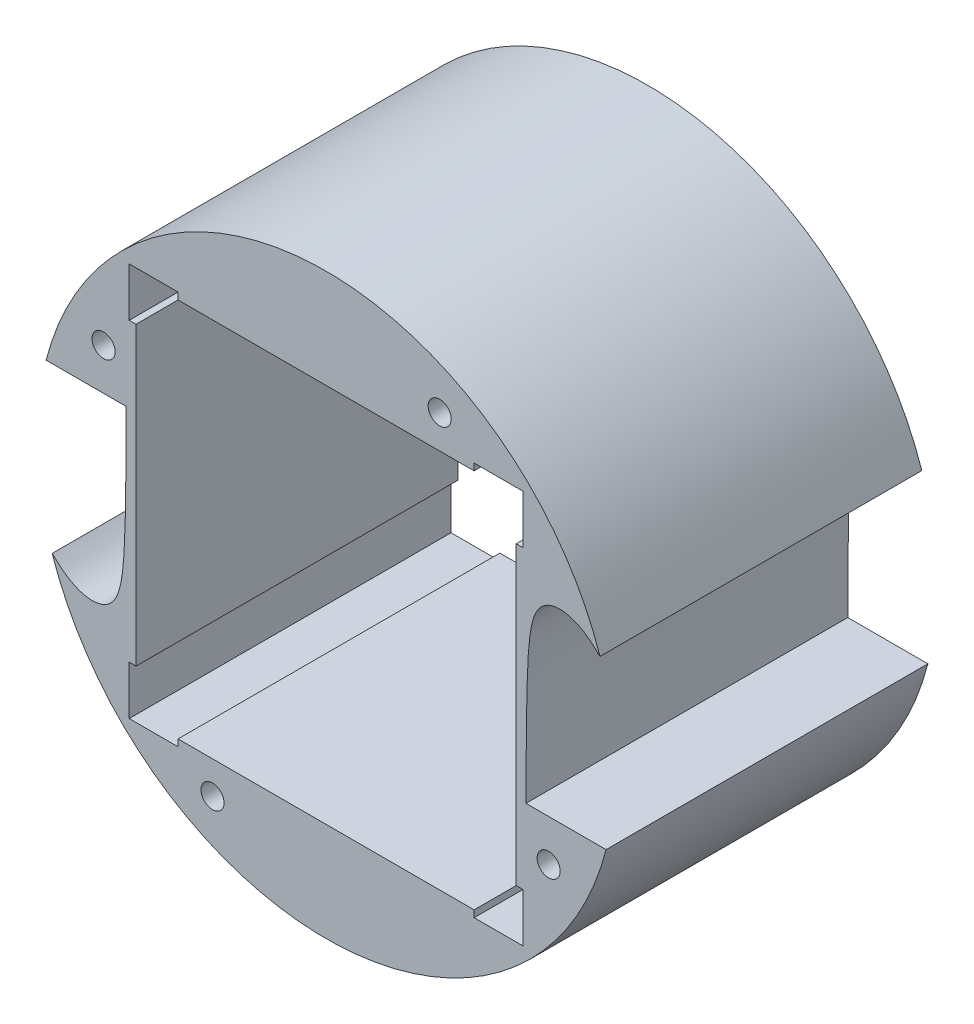
ISO-10303-21;
HEADER;
FILE_DESCRIPTION(('STEP AP214'),'2;1');
FILE_NAME('part.step','',(''),(''),'','','');
FILE_SCHEMA(('AUTOMOTIVE_DESIGN { 1 0 10303 214 1 1 1 1 }'));
ENDSEC;
DATA;
#1=APPLICATION_CONTEXT('core data for automotive mechanical design processes');
#2=APPLICATION_PROTOCOL_DEFINITION('international standard','automotive_design',2000,#1);
#3=PRODUCT_CONTEXT('',#1,'mechanical');
#4=PRODUCT('Part','Part','',(#3));
#5=PRODUCT_RELATED_PRODUCT_CATEGORY('part','',(#4));
#6=PRODUCT_DEFINITION_FORMATION('','',#4);
#7=PRODUCT_DEFINITION_CONTEXT('part definition',#1,'design');
#8=PRODUCT_DEFINITION('design','',#6,#7);
#9=PRODUCT_DEFINITION_SHAPE('','',#8);
#10=(LENGTH_UNIT() NAMED_UNIT(*) SI_UNIT(.MILLI.,.METRE.));
#11=(NAMED_UNIT(*) PLANE_ANGLE_UNIT() SI_UNIT($,.RADIAN.));
#12=(NAMED_UNIT(*) SI_UNIT($,.STERADIAN.) SOLID_ANGLE_UNIT());
#13=UNCERTAINTY_MEASURE_WITH_UNIT(LENGTH_MEASURE(1.E-05),#10,'distance_accuracy_value','');
#14=(GEOMETRIC_REPRESENTATION_CONTEXT(3) GLOBAL_UNCERTAINTY_ASSIGNED_CONTEXT((#13)) GLOBAL_UNIT_ASSIGNED_CONTEXT((#10,
#11,#12)) REPRESENTATION_CONTEXT('',''));
#15=CARTESIAN_POINT('',(0.,0.,0.));
#16=DIRECTION('',(0.,0.,1.));
#17=DIRECTION('',(1.,0.,0.));
#18=AXIS2_PLACEMENT_3D('',#15,#16,#17);
#19=CARTESIAN_POINT('',(0.,-19.0000000000005,85.));
#20=DIRECTION('',(0.,-1.,0.));
#21=DIRECTION('',(0.,0.,-1.));
#22=AXIS2_PLACEMENT_3D('',#19,#20,#21);
#23=PLANE('',#22);
#24=DIRECTION('',(-1.,0.,0.));
#25=VECTOR('',#24,1.);
#26=CARTESIAN_POINT('',(0.,-19.0000000000005,0.));
#27=LINE('',#26,#25);
#28=CARTESIAN_POINT('',(73.9481068047045,-19.0000000000005,0.));
#29=VERTEX_POINT('',#28);
#30=CARTESIAN_POINT('',(52.7825604111679,-19.0000000000005,0.));
#31=VERTEX_POINT('',#30);
#32=EDGE_CURVE('E373',#29,#31,#27,.T.);
#33=ORIENTED_EDGE('',*,*,#32,.T.);
#34=DIRECTION('',(0.,0.,-1.));
#35=VECTOR('',#34,1.);
#36=CARTESIAN_POINT('',(52.7825604111679,-19.0000000000005,85.));
#37=LINE('',#36,#35);
#38=CARTESIAN_POINT('',(52.7825604111679,-19.0000000000005,85.));
#39=VERTEX_POINT('',#38);
#40=EDGE_CURVE('E46',#39,#31,#37,.T.);
#41=ORIENTED_EDGE('',*,*,#40,.F.);
#42=DIRECTION('',(-1.,0.,0.));
#43=VECTOR('',#42,1.);
#44=CARTESIAN_POINT('',(0.,-19.0000000000005,85.));
#45=LINE('',#44,#43);
#46=CARTESIAN_POINT('',(73.9481068047045,-19.0000000000005,85.));
#47=VERTEX_POINT('',#46);
#48=EDGE_CURVE('E380',#47,#39,#45,.T.);
#49=ORIENTED_EDGE('',*,*,#48,.F.);
#50=DIRECTION('',(0.,0.,-1.));
#51=VECTOR('',#50,1.);
#52=CARTESIAN_POINT('',(73.9481068047045,-19.0000000000005,85.));
#53=LINE('',#52,#51);
#54=EDGE_CURVE('E11',#47,#29,#53,.T.);
#55=ORIENTED_EDGE('',*,*,#54,.T.);
#56=EDGE_LOOP('',(#33,#41,#49,#55));
#57=FACE_BOUND('',#56,.T.);
#58=ADVANCED_FACE('F39',(#57),#23,.F.);
#59=CARTESIAN_POINT('',(72.3485541994065,24.3928105239135,85.));
#60=CARTESIAN_POINT('',(69.5410863292133,27.0406670726869,85.));
#61=CARTESIAN_POINT('',(67.4285749685226,29.0891629375991,85.));
#62=CARTESIAN_POINT('',(64.3558311711543,30.2414418616122,85.));
#63=CARTESIAN_POINT('',(60.9630098948935,31.0736433067328,85.));
#64=CARTESIAN_POINT('',(59.0425450215383,30.5615193405047,85.));
#65=CARTESIAN_POINT('',(56.6739716777336,29.217193929156,85.));
#66=CARTESIAN_POINT('',(54.2413828381504,27.4887755431363,85.));
#67=CARTESIAN_POINT('',(52.9999999999998,25.1059549538429,85.));
#68=CARTESIAN_POINT('',(52.9999999999999,17.3743272101324,85.));
#69=CARTESIAN_POINT('',(52.7825604111679,-19.0000000000005,85.));
#70=B_SPLINE_CURVE_WITH_KNOTS('',10,(#59,#60,#61,#62,#63,#64,#65,#66,#67,#68,#69),.UNSPECIFIED.,
.F.,.F.,(11,11),(0.,1.),.UNSPECIFIED.);
#71=DIRECTION('',(0.,0.,-1.));
#72=VECTOR('',#71,1.);
#73=SURFACE_OF_LINEAR_EXTRUSION('',#70,#72);
#74=CARTESIAN_POINT('',(72.3485541994065,24.3928105239135,0.));
#75=CARTESIAN_POINT('',(69.5410863292133,27.0406670726869,0.));
#76=CARTESIAN_POINT('',(67.4285749685226,29.0891629375991,0.));
#77=CARTESIAN_POINT('',(64.3558311711543,30.2414418616122,0.));
#78=CARTESIAN_POINT('',(60.9630098948935,31.0736433067328,0.));
#79=CARTESIAN_POINT('',(59.0425450215383,30.5615193405047,0.));
#80=CARTESIAN_POINT('',(56.6739716777336,29.217193929156,0.));
#81=CARTESIAN_POINT('',(54.2413828381504,27.4887755431363,0.));
#82=CARTESIAN_POINT('',(52.9999999999998,25.1059549538429,0.));
#83=CARTESIAN_POINT('',(52.9999999999999,17.3743272101324,0.));
#84=CARTESIAN_POINT('',(52.7825604111679,-19.0000000000005,0.));
#85=B_SPLINE_CURVE_WITH_KNOTS('',10,(#74,#75,#76,#77,#78,#79,#80,#81,#82,#83,#84),.UNSPECIFIED.,
.F.,.F.,(11,11),(0.,1.),.UNSPECIFIED.);
#86=CARTESIAN_POINT('',(72.3485541994065,24.3928105239135,0.));
#87=VERTEX_POINT('',#86);
#88=EDGE_CURVE('E426',#87,#31,#85,.T.);
#89=ORIENTED_EDGE('',*,*,#88,.F.);
#90=DIRECTION('',(0.,0.,-1.));
#91=VECTOR('',#90,1.);
#92=CARTESIAN_POINT('',(72.3485541994065,24.3928105239135,85.));
#93=LINE('',#92,#91);
#94=CARTESIAN_POINT('',(72.3485541994065,24.3928105239135,85.));
#95=VERTEX_POINT('',#94);
#96=EDGE_CURVE('E454',#95,#87,#93,.T.);
#97=ORIENTED_EDGE('',*,*,#96,.F.);
#98=EDGE_CURVE('E383',#95,#39,#70,.T.);
#99=ORIENTED_EDGE('',*,*,#98,.T.);
#100=ORIENTED_EDGE('',*,*,#40,.T.);
#101=EDGE_LOOP('',(#89,#97,#99,#100));
#102=FACE_BOUND('',#101,.T.);
#103=ADVANCED_FACE('F394',(#102),#73,.T.);
#104=CARTESIAN_POINT('',(0.,0.,85.));
#105=DIRECTION('',(0.,0.,-1.));
#106=DIRECTION('',(-1.,0.,0.));
#107=AXIS2_PLACEMENT_3D('',#104,#105,#106);
#108=CYLINDRICAL_SURFACE('',#107,76.35);
#109=CARTESIAN_POINT('',(0.,0.,0.));
#110=DIRECTION('',(0.,0.,1.));
#111=DIRECTION('',(1.,0.,0.));
#112=AXIS2_PLACEMENT_3D('',#109,#110,#111);
#113=CIRCLE('',#112,76.35);
#114=CARTESIAN_POINT('',(-73.9481068047048,18.9999999999995,0.));
#115=VERTEX_POINT('',#114);
#116=EDGE_CURVE('E431',#87,#115,#113,.T.);
#117=ORIENTED_EDGE('',*,*,#116,.T.);
#118=DIRECTION('',(0.,0.,-1.));
#119=VECTOR('',#118,1.);
#120=CARTESIAN_POINT('',(-73.9481068047048,18.9999999999995,85.));
#121=LINE('',#120,#119);
#122=CARTESIAN_POINT('',(-73.9481068047048,18.9999999999995,85.));
#123=VERTEX_POINT('',#122);
#124=EDGE_CURVE('E451',#123,#115,#121,.T.);
#125=ORIENTED_EDGE('',*,*,#124,.F.);
#126=CARTESIAN_POINT('',(0.,0.,85.));
#127=DIRECTION('',(0.,0.,1.));
#128=DIRECTION('',(1.,0.,0.));
#129=AXIS2_PLACEMENT_3D('',#126,#127,#128);
#130=CIRCLE('',#129,76.35);
#131=EDGE_CURVE('E389',#95,#123,#130,.T.);
#132=ORIENTED_EDGE('',*,*,#131,.F.);
#133=ORIENTED_EDGE('',*,*,#96,.T.);
#134=EDGE_LOOP('',(#117,#125,#132,#133));
#135=FACE_BOUND('',#134,.T.);
#136=ADVANCED_FACE('F397',(#135),#108,.T.);
#137=CARTESIAN_POINT('',(0.,18.9999999999995,85.));
#138=DIRECTION('',(0.,1.,0.));
#139=DIRECTION('',(0.,0.,1.));
#140=AXIS2_PLACEMENT_3D('',#137,#138,#139);
#141=PLANE('',#140);
#142=DIRECTION('',(1.,0.,0.));
#143=VECTOR('',#142,1.);
#144=CARTESIAN_POINT('',(0.,18.9999999999995,0.));
#145=LINE('',#144,#143);
#146=CARTESIAN_POINT('',(-52.7825604111669,18.9999999999995,0.));
#147=VERTEX_POINT('',#146);
#148=EDGE_CURVE('E436',#115,#147,#145,.T.);
#149=ORIENTED_EDGE('',*,*,#148,.T.);
#150=DIRECTION('',(0.,0.,-1.));
#151=VECTOR('',#150,1.);
#152=CARTESIAN_POINT('',(-52.7825604111669,18.9999999999995,85.));
#153=LINE('',#152,#151);
#154=CARTESIAN_POINT('',(-52.7825604111669,18.9999999999995,85.));
#155=VERTEX_POINT('',#154);
#156=EDGE_CURVE('E449',#155,#147,#153,.T.);
#157=ORIENTED_EDGE('',*,*,#156,.F.);
#158=DIRECTION('',(1.,0.,0.));
#159=VECTOR('',#158,1.);
#160=CARTESIAN_POINT('',(0.,18.9999999999995,85.));
#161=LINE('',#160,#159);
#162=EDGE_CURVE('E420',#123,#155,#161,.T.);
#163=ORIENTED_EDGE('',*,*,#162,.F.);
#164=ORIENTED_EDGE('',*,*,#124,.T.);
#165=EDGE_LOOP('',(#149,#157,#163,#164));
#166=FACE_BOUND('',#165,.T.);
#167=ADVANCED_FACE('F401',(#166),#141,.F.);
#168=CARTESIAN_POINT('',(-72.3485541994062,-24.3928105239142,85.));
#169=CARTESIAN_POINT('',(-69.5410863292124,-27.0406670726874,85.));
#170=CARTESIAN_POINT('',(-67.4285749685217,-29.0891629375996,85.));
#171=CARTESIAN_POINT('',(-64.3558311711534,-30.2414418616126,85.));
#172=CARTESIAN_POINT('',(-60.9630098948926,-31.0736433067332,85.));
#173=CARTESIAN_POINT('',(-59.0425450215374,-30.5615193405052,85.));
#174=CARTESIAN_POINT('',(-56.6739716777327,-29.2171939291566,85.));
#175=CARTESIAN_POINT('',(-54.2413828381494,-27.4887755431368,85.));
#176=CARTESIAN_POINT('',(-52.9999999999989,-25.1059549538434,85.));
#177=CARTESIAN_POINT('',(-52.9999999999989,-17.3743272101329,85.));
#178=CARTESIAN_POINT('',(-52.7825604111669,18.9999999999995,85.));
#179=B_SPLINE_CURVE_WITH_KNOTS('',10,(#168,#169,#170,#171,#172,#173,#174,#175,#176,#177,#178),
.UNSPECIFIED.,.F.,.F.,(11,11),(0.,1.),.UNSPECIFIED.);
#180=DIRECTION('',(0.,0.,-1.));
#181=VECTOR('',#180,1.);
#182=SURFACE_OF_LINEAR_EXTRUSION('',#179,#181);
#183=CARTESIAN_POINT('',(-72.3485541994062,-24.3928105239142,0.));
#184=CARTESIAN_POINT('',(-69.5410863292124,-27.0406670726874,0.));
#185=CARTESIAN_POINT('',(-67.4285749685217,-29.0891629375996,0.));
#186=CARTESIAN_POINT('',(-64.3558311711534,-30.2414418616126,0.));
#187=CARTESIAN_POINT('',(-60.9630098948926,-31.0736433067332,0.));
#188=CARTESIAN_POINT('',(-59.0425450215374,-30.5615193405052,0.));
#189=CARTESIAN_POINT('',(-56.6739716777327,-29.2171939291566,0.));
#190=CARTESIAN_POINT('',(-54.2413828381494,-27.4887755431368,0.));
#191=CARTESIAN_POINT('',(-52.9999999999989,-25.1059549538434,0.));
#192=CARTESIAN_POINT('',(-52.9999999999989,-17.3743272101329,0.));
#193=CARTESIAN_POINT('',(-52.7825604111669,18.9999999999995,0.));
#194=B_SPLINE_CURVE_WITH_KNOTS('',10,(#183,#184,#185,#186,#187,#188,#189,#190,#191,#192,#193),
.UNSPECIFIED.,.F.,.F.,(11,11),(0.,1.),.UNSPECIFIED.);
#195=CARTESIAN_POINT('',(-72.3485541994062,-24.3928105239142,0.));
#196=VERTEX_POINT('',#195);
#197=EDGE_CURVE('E439',#196,#147,#194,.T.);
#198=ORIENTED_EDGE('',*,*,#197,.F.);
#199=DIRECTION('',(0.,0.,-1.));
#200=VECTOR('',#199,1.);
#201=CARTESIAN_POINT('',(-72.3485541994062,-24.3928105239142,85.));
#202=LINE('',#201,#200);
#203=CARTESIAN_POINT('',(-72.3485541994062,-24.3928105239142,85.));
#204=VERTEX_POINT('',#203);
#205=EDGE_CURVE('E419',#204,#196,#202,.T.);
#206=ORIENTED_EDGE('',*,*,#205,.F.);
#207=EDGE_CURVE('E413',#204,#155,#179,.T.);
#208=ORIENTED_EDGE('',*,*,#207,.T.);
#209=ORIENTED_EDGE('',*,*,#156,.T.);
#210=EDGE_LOOP('',(#198,#206,#208,#209));
#211=FACE_BOUND('',#210,.T.);
#212=ADVANCED_FACE('F405',(#211),#182,.T.);
#213=CARTESIAN_POINT('',(0.,0.,85.));
#214=DIRECTION('',(0.,0.,-1.));
#215=DIRECTION('',(-1.,0.,0.));
#216=AXIS2_PLACEMENT_3D('',#213,#214,#215);
#217=CYLINDRICAL_SURFACE('',#216,76.35);
#218=CARTESIAN_POINT('',(0.,0.,0.));
#219=DIRECTION('',(0.,0.,1.));
#220=DIRECTION('',(1.,0.,0.));
#221=AXIS2_PLACEMENT_3D('',#218,#219,#220);
#222=CIRCLE('',#221,76.35);
#223=EDGE_CURVE('E381',#196,#29,#222,.T.);
#224=ORIENTED_EDGE('',*,*,#223,.T.);
#225=ORIENTED_EDGE('',*,*,#54,.F.);
#226=CARTESIAN_POINT('',(0.,0.,85.));
#227=DIRECTION('',(0.,0.,1.));
#228=DIRECTION('',(1.,0.,0.));
#229=AXIS2_PLACEMENT_3D('',#226,#227,#228);
#230=CIRCLE('',#229,76.35);
#231=EDGE_CURVE('E378',#204,#47,#230,.T.);
#232=ORIENTED_EDGE('',*,*,#231,.F.);
#233=ORIENTED_EDGE('',*,*,#205,.T.);
#234=EDGE_LOOP('',(#224,#225,#232,#233));
#235=FACE_BOUND('',#234,.T.);
#236=ADVANCED_FACE('F410',(#235),#217,.T.);
#237=CARTESIAN_POINT('',(0.,0.,85.));
#238=DIRECTION('',(0.,0.,1.));
#239=DIRECTION('',(1.,0.,0.));
#240=AXIS2_PLACEMENT_3D('',#237,#238,#239);
#241=PLANE('',#240);
#242=CARTESIAN_POINT('',(-30.0000000000008,-58.782560411168,85.));
#243=DIRECTION('',(0.,0.,1.));
#244=DIRECTION('',(1.,0.,0.));
#245=AXIS2_PLACEMENT_3D('',#242,#243,#244);
#246=CIRCLE('',#245,3.05);
#247=CARTESIAN_POINT('',(-26.9500000000008,-58.782560411168,85.));
#248=VERTEX_POINT('',#247);
#249=EDGE_CURVE('E241',#248,#248,#246,.T.);
#250=ORIENTED_EDGE('',*,*,#249,.F.);
#251=EDGE_LOOP('',(#250));
#252=FACE_BOUND('',#251,.T.);
#253=CARTESIAN_POINT('',(-58.7825604111669,29.9999999999995,85.));
#254=DIRECTION('',(0.,0.,1.));
#255=DIRECTION('',(1.,0.,0.));
#256=AXIS2_PLACEMENT_3D('',#253,#254,#255);
#257=CIRCLE('',#256,3.05);
#258=CARTESIAN_POINT('',(-55.7325604111669,29.9999999999995,85.));
#259=VERTEX_POINT('',#258);
#260=EDGE_CURVE('E944',#259,#259,#257,.T.);
#261=ORIENTED_EDGE('',*,*,#260,.F.);
#262=EDGE_LOOP('',(#261));
#263=FACE_BOUND('',#262,.T.);
#264=CARTESIAN_POINT('',(30.,59.,85.));
#265=DIRECTION('',(0.,0.,1.));
#266=DIRECTION('',(1.,0.,0.));
#267=AXIS2_PLACEMENT_3D('',#264,#265,#266);
#268=CIRCLE('',#267,3.05);
#269=CARTESIAN_POINT('',(33.05,59.,85.));
#270=VERTEX_POINT('',#269);
#271=EDGE_CURVE('E936',#270,#270,#268,.T.);
#272=ORIENTED_EDGE('',*,*,#271,.F.);
#273=EDGE_LOOP('',(#272));
#274=FACE_BOUND('',#273,.T.);
#275=CARTESIAN_POINT('',(58.7825604111679,-29.9999999999995,85.));
#276=DIRECTION('',(0.,0.,1.));
#277=DIRECTION('',(1.,0.,0.));
#278=AXIS2_PLACEMENT_3D('',#275,#276,#277);
#279=CIRCLE('',#278,3.05);
#280=CARTESIAN_POINT('',(61.8325604111679,-29.9999999999995,85.));
#281=VERTEX_POINT('',#280);
#282=EDGE_CURVE('E937',#281,#281,#279,.T.);
#283=ORIENTED_EDGE('',*,*,#282,.F.);
#284=EDGE_LOOP('',(#283));
#285=FACE_BOUND('',#284,.T.);
#286=DIRECTION('',(1.,0.,0.));
#287=VECTOR('',#286,1.);
#288=CARTESIAN_POINT('',(38.7,-50.2,85.));
#289=LINE('',#288,#287);
#290=CARTESIAN_POINT('',(-39.1,-50.2,85.));
#291=VERTEX_POINT('',#290);
#292=CARTESIAN_POINT('',(39.1,-50.2,85.));
#293=VERTEX_POINT('',#292);
#294=EDGE_CURVE('E213',#291,#293,#289,.T.);
#295=ORIENTED_EDGE('',*,*,#294,.F.);
#296=DIRECTION('',(0.,-1.,0.));
#297=VECTOR('',#296,1.);
#298=CARTESIAN_POINT('',(-39.1,-50.2,85.));
#299=LINE('',#298,#297);
#300=CARTESIAN_POINT('',(-39.1,-52.,85.));
#301=VERTEX_POINT('',#300);
#302=EDGE_CURVE('E218',#291,#301,#299,.T.);
#303=ORIENTED_EDGE('',*,*,#302,.T.);
#304=DIRECTION('',(1.,0.,0.));
#305=VECTOR('',#304,1.);
#306=CARTESIAN_POINT('',(-52.,-52.,85.));
#307=LINE('',#306,#305);
#308=CARTESIAN_POINT('',(-52.,-52.,85.));
#309=VERTEX_POINT('',#308);
#310=EDGE_CURVE('E53',#309,#301,#307,.T.);
#311=ORIENTED_EDGE('',*,*,#310,.F.);
#312=DIRECTION('',(0.,-1.,0.));
#313=VECTOR('',#312,1.);
#314=CARTESIAN_POINT('',(-52.,-38.7,85.));
#315=LINE('',#314,#313);
#316=CARTESIAN_POINT('',(-52.,-39.1,85.));
#317=VERTEX_POINT('',#316);
#318=EDGE_CURVE('E337',#317,#309,#315,.T.);
#319=ORIENTED_EDGE('',*,*,#318,.F.);
#320=DIRECTION('',(1.,0.,0.));
#321=VECTOR('',#320,1.);
#322=CARTESIAN_POINT('',(-50.2,-39.1,85.));
#323=LINE('',#322,#321);
#324=CARTESIAN_POINT('',(-50.2,-39.1,85.));
#325=VERTEX_POINT('',#324);
#326=EDGE_CURVE('E253',#317,#325,#323,.T.);
#327=ORIENTED_EDGE('',*,*,#326,.T.);
#328=DIRECTION('',(0.,-1.,0.));
#329=VECTOR('',#328,1.);
#330=CARTESIAN_POINT('',(-50.2,-38.7,85.));
#331=LINE('',#330,#329);
#332=CARTESIAN_POINT('',(-50.2,39.1,85.));
#333=VERTEX_POINT('',#332);
#334=EDGE_CURVE('E226',#333,#325,#331,.T.);
#335=ORIENTED_EDGE('',*,*,#334,.F.);
#336=DIRECTION('',(-1.,0.,0.));
#337=VECTOR('',#336,1.);
#338=CARTESIAN_POINT('',(-50.2,39.1,85.));
#339=LINE('',#338,#337);
#340=CARTESIAN_POINT('',(-52.,39.1,85.));
#341=VERTEX_POINT('',#340);
#342=EDGE_CURVE('E293',#333,#341,#339,.T.);
#343=ORIENTED_EDGE('',*,*,#342,.T.);
#344=DIRECTION('',(0.,-1.,0.));
#345=VECTOR('',#344,1.);
#346=CARTESIAN_POINT('',(-52.,52.,85.));
#347=LINE('',#346,#345);
#348=CARTESIAN_POINT('',(-52.,52.,85.));
#349=VERTEX_POINT('',#348);
#350=EDGE_CURVE('E354',#349,#341,#347,.T.);
#351=ORIENTED_EDGE('',*,*,#350,.F.);
#352=DIRECTION('',(-1.,0.,0.));
#353=VECTOR('',#352,1.);
#354=CARTESIAN_POINT('',(-38.7,52.,85.));
#355=LINE('',#354,#353);
#356=CARTESIAN_POINT('',(-39.1,52.,85.));
#357=VERTEX_POINT('',#356);
#358=EDGE_CURVE('E317',#357,#349,#355,.T.);
#359=ORIENTED_EDGE('',*,*,#358,.F.);
#360=DIRECTION('',(0.,-1.,0.));
#361=VECTOR('',#360,1.);
#362=CARTESIAN_POINT('',(-39.1,50.2,85.));
#363=LINE('',#362,#361);
#364=CARTESIAN_POINT('',(-39.1,50.2,85.));
#365=VERTEX_POINT('',#364);
#366=EDGE_CURVE('E313',#357,#365,#363,.T.);
#367=ORIENTED_EDGE('',*,*,#366,.T.);
#368=DIRECTION('',(-1.,0.,0.));
#369=VECTOR('',#368,1.);
#370=CARTESIAN_POINT('',(38.6999999999999,50.2,85.));
#371=LINE('',#370,#369);
#372=CARTESIAN_POINT('',(39.0999999999999,50.2,85.));
#373=VERTEX_POINT('',#372);
#374=EDGE_CURVE('E375',#373,#365,#371,.T.);
#375=ORIENTED_EDGE('',*,*,#374,.F.);
#376=DIRECTION('',(0.,1.,0.));
#377=VECTOR('',#376,1.);
#378=CARTESIAN_POINT('',(39.0999999999999,50.2,85.));
#379=LINE('',#378,#377);
#380=CARTESIAN_POINT('',(39.0999999999999,52.,85.));
#381=VERTEX_POINT('',#380);
#382=EDGE_CURVE('E282',#373,#381,#379,.T.);
#383=ORIENTED_EDGE('',*,*,#382,.T.);
#384=DIRECTION('',(-1.,0.,0.));
#385=VECTOR('',#384,1.);
#386=CARTESIAN_POINT('',(51.9999999999998,52.,85.));
#387=LINE('',#386,#385);
#388=CARTESIAN_POINT('',(51.9999999999998,52.,85.));
#389=VERTEX_POINT('',#388);
#390=EDGE_CURVE('E343',#389,#381,#387,.T.);
#391=ORIENTED_EDGE('',*,*,#390,.F.);
#392=DIRECTION('',(0.,1.,0.));
#393=VECTOR('',#392,1.);
#394=CARTESIAN_POINT('',(51.9999999999998,38.6999999999999,85.));
#395=LINE('',#394,#393);
#396=CARTESIAN_POINT('',(51.9999999999998,39.0999999999999,85.));
#397=VERTEX_POINT('',#396);
#398=EDGE_CURVE('E341',#397,#389,#395,.T.);
#399=ORIENTED_EDGE('',*,*,#398,.F.);
#400=DIRECTION('',(-1.,0.,0.));
#401=VECTOR('',#400,1.);
#402=CARTESIAN_POINT('',(50.2,39.0999999999999,85.));
#403=LINE('',#402,#401);
#404=CARTESIAN_POINT('',(50.2,39.0999999999999,85.));
#405=VERTEX_POINT('',#404);
#406=EDGE_CURVE('E273',#397,#405,#403,.T.);
#407=ORIENTED_EDGE('',*,*,#406,.T.);
#408=DIRECTION('',(0.,1.,0.));
#409=VECTOR('',#408,1.);
#410=CARTESIAN_POINT('',(50.2000000000003,-38.7000000000005,85.));
#411=LINE('',#410,#409);
#412=CARTESIAN_POINT('',(50.2000000000003,-39.1000000000005,85.));
#413=VERTEX_POINT('',#412);
#414=EDGE_CURVE('E363',#413,#405,#411,.T.);
#415=ORIENTED_EDGE('',*,*,#414,.F.);
#416=DIRECTION('',(1.,0.,0.));
#417=VECTOR('',#416,1.);
#418=CARTESIAN_POINT('',(50.2000000000003,-39.1000000000005,85.));
#419=LINE('',#418,#417);
#420=CARTESIAN_POINT('',(51.9999999999998,-39.1000000000005,85.));
#421=VERTEX_POINT('',#420);
#422=EDGE_CURVE('E251',#413,#421,#419,.T.);
#423=ORIENTED_EDGE('',*,*,#422,.T.);
#424=DIRECTION('',(0.,1.,0.));
#425=VECTOR('',#424,1.);
#426=CARTESIAN_POINT('',(51.9999999999998,-52.,85.));
#427=LINE('',#426,#425);
#428=CARTESIAN_POINT('',(51.9999999999998,-52.,85.));
#429=VERTEX_POINT('',#428);
#430=EDGE_CURVE('E331',#429,#421,#427,.T.);
#431=ORIENTED_EDGE('',*,*,#430,.F.);
#432=DIRECTION('',(1.,0.,0.));
#433=VECTOR('',#432,1.);
#434=CARTESIAN_POINT('',(38.7,-52.0000000000001,85.));
#435=LINE('',#434,#433);
#436=CARTESIAN_POINT('',(39.1,-52.0000000000001,85.));
#437=VERTEX_POINT('',#436);
#438=EDGE_CURVE('E329',#437,#429,#435,.T.);
#439=ORIENTED_EDGE('',*,*,#438,.F.);
#440=DIRECTION('',(0.,1.,0.));
#441=VECTOR('',#440,1.);
#442=CARTESIAN_POINT('',(39.1,-50.2,85.));
#443=LINE('',#442,#441);
#444=EDGE_CURVE('E221',#437,#293,#443,.T.);
#445=ORIENTED_EDGE('',*,*,#444,.T.);
#446=EDGE_LOOP('',(#295,#303,#311,#319,#327,#335,#343,#351,#359,#367,#375,#383,#391,#399,#407,
#415,#423,#431,#439,#445));
#447=FACE_BOUND('',#446,.T.);
#448=ORIENTED_EDGE('',*,*,#207,.F.);
#449=ORIENTED_EDGE('',*,*,#231,.T.);
#450=ORIENTED_EDGE('',*,*,#48,.T.);
#451=ORIENTED_EDGE('',*,*,#98,.F.);
#452=ORIENTED_EDGE('',*,*,#131,.T.);
#453=ORIENTED_EDGE('',*,*,#162,.T.);
#454=EDGE_LOOP('',(#448,#449,#450,#451,#452,#453));
#455=FACE_BOUND('',#454,.T.);
#456=ADVANCED_FACE('F215',(#252,#263,#274,#285,#447,#455),#241,.T.);
#457=CARTESIAN_POINT('',(0.,0.,0.));
#458=DIRECTION('',(0.,0.,1.));
#459=DIRECTION('',(1.,0.,0.));
#460=AXIS2_PLACEMENT_3D('',#457,#458,#459);
#461=PLANE('',#460);
#462=CARTESIAN_POINT('',(-30.0000000000008,-58.782560411168,0.));
#463=DIRECTION('',(0.,0.,1.));
#464=DIRECTION('',(1.,0.,0.));
#465=AXIS2_PLACEMENT_3D('',#462,#463,#464);
#466=CIRCLE('',#465,3.05);
#467=CARTESIAN_POINT('',(-26.9500000000008,-58.782560411168,0.));
#468=VERTEX_POINT('',#467);
#469=EDGE_CURVE('E238',#468,#468,#466,.T.);
#470=ORIENTED_EDGE('',*,*,#469,.T.);
#471=EDGE_LOOP('',(#470));
#472=FACE_BOUND('',#471,.T.);
#473=CARTESIAN_POINT('',(-58.7825604111669,29.9999999999995,0.));
#474=DIRECTION('',(0.,0.,1.));
#475=DIRECTION('',(1.,0.,0.));
#476=AXIS2_PLACEMENT_3D('',#473,#474,#475);
#477=CIRCLE('',#476,3.05);
#478=CARTESIAN_POINT('',(-55.7325604111669,29.9999999999995,0.));
#479=VERTEX_POINT('',#478);
#480=EDGE_CURVE('E889',#479,#479,#477,.T.);
#481=ORIENTED_EDGE('',*,*,#480,.T.);
#482=EDGE_LOOP('',(#481));
#483=FACE_BOUND('',#482,.T.);
#484=CARTESIAN_POINT('',(30.,59.,0.));
#485=DIRECTION('',(0.,0.,1.));
#486=DIRECTION('',(1.,0.,0.));
#487=AXIS2_PLACEMENT_3D('',#484,#485,#486);
#488=CIRCLE('',#487,3.05);
#489=CARTESIAN_POINT('',(33.05,59.,0.));
#490=VERTEX_POINT('',#489);
#491=EDGE_CURVE('E893',#490,#490,#488,.T.);
#492=ORIENTED_EDGE('',*,*,#491,.T.);
#493=EDGE_LOOP('',(#492));
#494=FACE_BOUND('',#493,.T.);
#495=CARTESIAN_POINT('',(58.7825604111679,-29.9999999999995,0.));
#496=DIRECTION('',(0.,0.,1.));
#497=DIRECTION('',(1.,0.,0.));
#498=AXIS2_PLACEMENT_3D('',#495,#496,#497);
#499=CIRCLE('',#498,3.05);
#500=CARTESIAN_POINT('',(61.8325604111679,-29.9999999999995,0.));
#501=VERTEX_POINT('',#500);
#502=EDGE_CURVE('E897',#501,#501,#499,.T.);
#503=ORIENTED_EDGE('',*,*,#502,.T.);
#504=EDGE_LOOP('',(#503));
#505=FACE_BOUND('',#504,.T.);
#506=DIRECTION('',(0.,1.,0.));
#507=VECTOR('',#506,1.);
#508=CARTESIAN_POINT('',(-50.2,-38.7,0.));
#509=LINE('',#508,#507);
#510=CARTESIAN_POINT('',(-50.2,-39.1,0.));
#511=VERTEX_POINT('',#510);
#512=CARTESIAN_POINT('',(-50.2,39.1,0.));
#513=VERTEX_POINT('',#512);
#514=EDGE_CURVE('E370',#511,#513,#509,.T.);
#515=ORIENTED_EDGE('',*,*,#514,.F.);
#516=DIRECTION('',(-1.,0.,0.));
#517=VECTOR('',#516,1.);
#518=CARTESIAN_POINT('',(-50.2,-39.1,0.));
#519=LINE('',#518,#517);
#520=CARTESIAN_POINT('',(-52.,-39.1,0.));
#521=VERTEX_POINT('',#520);
#522=EDGE_CURVE('E248',#511,#521,#519,.T.);
#523=ORIENTED_EDGE('',*,*,#522,.T.);
#524=DIRECTION('',(0.,1.,0.));
#525=VECTOR('',#524,1.);
#526=CARTESIAN_POINT('',(-52.,-38.7,0.));
#527=LINE('',#526,#525);
#528=CARTESIAN_POINT('',(-52.,-52.,0.));
#529=VERTEX_POINT('',#528);
#530=EDGE_CURVE('E358',#529,#521,#527,.T.);
#531=ORIENTED_EDGE('',*,*,#530,.F.);
#532=DIRECTION('',(-1.,0.,0.));
#533=VECTOR('',#532,1.);
#534=CARTESIAN_POINT('',(-52.,-52.,0.));
#535=LINE('',#534,#533);
#536=CARTESIAN_POINT('',(-39.1,-52.,0.));
#537=VERTEX_POINT('',#536);
#538=EDGE_CURVE('E360',#537,#529,#535,.T.);
#539=ORIENTED_EDGE('',*,*,#538,.F.);
#540=DIRECTION('',(0.,1.,0.));
#541=VECTOR('',#540,1.);
#542=CARTESIAN_POINT('',(-39.1,-50.2,0.));
#543=LINE('',#542,#541);
#544=CARTESIAN_POINT('',(-39.1,-50.2,0.));
#545=VERTEX_POINT('',#544);
#546=EDGE_CURVE('E245',#537,#545,#543,.T.);
#547=ORIENTED_EDGE('',*,*,#546,.T.);
#548=DIRECTION('',(-1.,0.,0.));
#549=VECTOR('',#548,1.);
#550=CARTESIAN_POINT('',(38.7,-50.2,0.));
#551=LINE('',#550,#549);
#552=CARTESIAN_POINT('',(39.1,-50.2,0.));
#553=VERTEX_POINT('',#552);
#554=EDGE_CURVE('E231',#553,#545,#551,.T.);
#555=ORIENTED_EDGE('',*,*,#554,.F.);
#556=DIRECTION('',(0.,-1.,0.));
#557=VECTOR('',#556,1.);
#558=CARTESIAN_POINT('',(39.1,-50.2,0.));
#559=LINE('',#558,#557);
#560=CARTESIAN_POINT('',(39.1,-52.0000000000001,0.));
#561=VERTEX_POINT('',#560);
#562=EDGE_CURVE('E270',#553,#561,#559,.T.);
#563=ORIENTED_EDGE('',*,*,#562,.T.);
#564=DIRECTION('',(-1.,0.,0.));
#565=VECTOR('',#564,1.);
#566=CARTESIAN_POINT('',(38.7,-52.0000000000001,0.));
#567=LINE('',#566,#565);
#568=CARTESIAN_POINT('',(51.9999999999998,-52.,0.));
#569=VERTEX_POINT('',#568);
#570=EDGE_CURVE('E327',#569,#561,#567,.T.);
#571=ORIENTED_EDGE('',*,*,#570,.F.);
#572=DIRECTION('',(0.,-1.,0.));
#573=VECTOR('',#572,1.);
#574=CARTESIAN_POINT('',(51.9999999999998,-52.,0.));
#575=LINE('',#574,#573);
#576=CARTESIAN_POINT('',(51.9999999999998,-39.1000000000005,0.));
#577=VERTEX_POINT('',#576);
#578=EDGE_CURVE('E325',#577,#569,#575,.T.);
#579=ORIENTED_EDGE('',*,*,#578,.F.);
#580=DIRECTION('',(-1.,0.,0.));
#581=VECTOR('',#580,1.);
#582=CARTESIAN_POINT('',(50.2000000000003,-39.1000000000005,0.));
#583=LINE('',#582,#581);
#584=CARTESIAN_POINT('',(50.2000000000003,-39.1000000000005,0.));
#585=VERTEX_POINT('',#584);
#586=EDGE_CURVE('E265',#577,#585,#583,.T.);
#587=ORIENTED_EDGE('',*,*,#586,.T.);
#588=DIRECTION('',(0.,-1.,0.));
#589=VECTOR('',#588,1.);
#590=CARTESIAN_POINT('',(50.2000000000003,-38.7000000000005,0.));
#591=LINE('',#590,#589);
#592=CARTESIAN_POINT('',(50.2,39.0999999999999,0.));
#593=VERTEX_POINT('',#592);
#594=EDGE_CURVE('E225',#593,#585,#591,.T.);
#595=ORIENTED_EDGE('',*,*,#594,.F.);
#596=DIRECTION('',(1.,0.,0.));
#597=VECTOR('',#596,1.);
#598=CARTESIAN_POINT('',(50.2,39.0999999999999,0.));
#599=LINE('',#598,#597);
#600=CARTESIAN_POINT('',(51.9999999999998,39.0999999999999,0.));
#601=VERTEX_POINT('',#600);
#602=EDGE_CURVE('E279',#593,#601,#599,.T.);
#603=ORIENTED_EDGE('',*,*,#602,.T.);
#604=DIRECTION('',(0.,-1.,0.));
#605=VECTOR('',#604,1.);
#606=CARTESIAN_POINT('',(51.9999999999998,38.6999999999999,0.));
#607=LINE('',#606,#605);
#608=CARTESIAN_POINT('',(51.9999999999998,52.,0.));
#609=VERTEX_POINT('',#608);
#610=EDGE_CURVE('E332',#609,#601,#607,.T.);
#611=ORIENTED_EDGE('',*,*,#610,.F.);
#612=DIRECTION('',(1.,0.,0.));
#613=VECTOR('',#612,1.);
#614=CARTESIAN_POINT('',(51.9999999999998,52.,0.));
#615=LINE('',#614,#613);
#616=CARTESIAN_POINT('',(39.0999999999999,52.,0.));
#617=VERTEX_POINT('',#616);
#618=EDGE_CURVE('E338',#617,#609,#615,.T.);
#619=ORIENTED_EDGE('',*,*,#618,.F.);
#620=DIRECTION('',(0.,-1.,0.));
#621=VECTOR('',#620,1.);
#622=CARTESIAN_POINT('',(39.0999999999999,50.2,0.));
#623=LINE('',#622,#621);
#624=CARTESIAN_POINT('',(39.0999999999999,50.2,0.));
#625=VERTEX_POINT('',#624);
#626=EDGE_CURVE('E290',#617,#625,#623,.T.);
#627=ORIENTED_EDGE('',*,*,#626,.T.);
#628=DIRECTION('',(1.,0.,0.));
#629=VECTOR('',#628,1.);
#630=CARTESIAN_POINT('',(38.6999999999999,50.2,0.));
#631=LINE('',#630,#629);
#632=CARTESIAN_POINT('',(-39.1,50.2,0.));
#633=VERTEX_POINT('',#632);
#634=EDGE_CURVE('E368',#633,#625,#631,.T.);
#635=ORIENTED_EDGE('',*,*,#634,.F.);
#636=DIRECTION('',(0.,1.,0.));
#637=VECTOR('',#636,1.);
#638=CARTESIAN_POINT('',(-39.1,50.2,0.));
#639=LINE('',#638,#637);
#640=CARTESIAN_POINT('',(-39.1,52.,0.));
#641=VERTEX_POINT('',#640);
#642=EDGE_CURVE('E314',#633,#641,#639,.T.);
#643=ORIENTED_EDGE('',*,*,#642,.T.);
#644=DIRECTION('',(1.,0.,0.));
#645=VECTOR('',#644,1.);
#646=CARTESIAN_POINT('',(-38.7,52.,0.));
#647=LINE('',#646,#645);
#648=CARTESIAN_POINT('',(-52.,52.,0.));
#649=VERTEX_POINT('',#648);
#650=EDGE_CURVE('E349',#649,#641,#647,.T.);
#651=ORIENTED_EDGE('',*,*,#650,.F.);
#652=DIRECTION('',(0.,1.,0.));
#653=VECTOR('',#652,1.);
#654=CARTESIAN_POINT('',(-52.,52.,0.));
#655=LINE('',#654,#653);
#656=CARTESIAN_POINT('',(-52.,39.1,0.));
#657=VERTEX_POINT('',#656);
#658=EDGE_CURVE('E344',#657,#649,#655,.T.);
#659=ORIENTED_EDGE('',*,*,#658,.F.);
#660=DIRECTION('',(1.,0.,0.));
#661=VECTOR('',#660,1.);
#662=CARTESIAN_POINT('',(-50.2,39.1,0.));
#663=LINE('',#662,#661);
#664=EDGE_CURVE('E308',#657,#513,#663,.T.);
#665=ORIENTED_EDGE('',*,*,#664,.T.);
#666=EDGE_LOOP('',(#515,#523,#531,#539,#547,#555,#563,#571,#579,#587,#595,#603,#611,#619,#627,
#635,#643,#651,#659,#665));
#667=FACE_BOUND('',#666,.T.);
#668=ORIENTED_EDGE('',*,*,#32,.F.);
#669=ORIENTED_EDGE('',*,*,#223,.F.);
#670=ORIENTED_EDGE('',*,*,#197,.T.);
#671=ORIENTED_EDGE('',*,*,#148,.F.);
#672=ORIENTED_EDGE('',*,*,#116,.F.);
#673=ORIENTED_EDGE('',*,*,#88,.T.);
#674=EDGE_LOOP('',(#668,#669,#670,#671,#672,#673));
#675=FACE_BOUND('',#674,.T.);
#676=ADVANCED_FACE('F465',(#472,#483,#494,#505,#667,#675),#461,.F.);
#677=CARTESIAN_POINT('',(50.2000000000003,-38.7000000000005,-146.512525061853));
#678=DIRECTION('',(1.,0.,0.));
#679=DIRECTION('',(0.,1.,0.));
#680=AXIS2_PLACEMENT_3D('',#677,#678,#679);
#681=PLANE('',#680);
#682=ORIENTED_EDGE('',*,*,#594,.T.);
#683=DIRECTION('',(0.,0.,1.));
#684=VECTOR('',#683,1.);
#685=CARTESIAN_POINT('',(50.2000000000003,-39.1000000000005,-1.84390889145866));
#686=LINE('',#685,#684);
#687=EDGE_CURVE('E261',#585,#413,#686,.T.);
#688=ORIENTED_EDGE('',*,*,#687,.T.);
#689=ORIENTED_EDGE('',*,*,#414,.T.);
#690=DIRECTION('',(0.,0.,1.));
#691=VECTOR('',#690,1.);
#692=CARTESIAN_POINT('',(50.2,39.0999999999999,-1.84390889145866));
#693=LINE('',#692,#691);
#694=EDGE_CURVE('E283',#593,#405,#693,.T.);
#695=ORIENTED_EDGE('',*,*,#694,.F.);
#696=EDGE_LOOP('',(#682,#688,#689,#695));
#697=FACE_BOUND('',#696,.T.);
#698=ADVANCED_FACE('F507',(#697),#681,.F.);
#699=CARTESIAN_POINT('',(38.6999999999999,50.2,-146.512525061853));
#700=DIRECTION('',(0.,1.,0.));
#701=DIRECTION('',(0.,0.,1.));
#702=AXIS2_PLACEMENT_3D('',#699,#700,#701);
#703=PLANE('',#702);
#704=ORIENTED_EDGE('',*,*,#634,.T.);
#705=DIRECTION('',(0.,0.,1.));
#706=VECTOR('',#705,1.);
#707=CARTESIAN_POINT('',(39.0999999999999,50.2,-1.84390889145866));
#708=LINE('',#707,#706);
#709=EDGE_CURVE('E297',#625,#373,#708,.T.);
#710=ORIENTED_EDGE('',*,*,#709,.T.);
#711=ORIENTED_EDGE('',*,*,#374,.T.);
#712=DIRECTION('',(0.,0.,1.));
#713=VECTOR('',#712,1.);
#714=CARTESIAN_POINT('',(-39.1,50.2,-1.84390889145866));
#715=LINE('',#714,#713);
#716=EDGE_CURVE('E318',#633,#365,#715,.T.);
#717=ORIENTED_EDGE('',*,*,#716,.F.);
#718=EDGE_LOOP('',(#704,#710,#711,#717));
#719=FACE_BOUND('',#718,.T.);
#720=ADVANCED_FACE('F512',(#719),#703,.F.);
#721=CARTESIAN_POINT('',(-50.2,-38.7,-146.512525061853));
#722=DIRECTION('',(-1.,0.,0.));
#723=DIRECTION('',(0.,0.,1.));
#724=AXIS2_PLACEMENT_3D('',#721,#722,#723);
#725=PLANE('',#724);
#726=ORIENTED_EDGE('',*,*,#514,.T.);
#727=DIRECTION('',(0.,0.,1.));
#728=VECTOR('',#727,1.);
#729=CARTESIAN_POINT('',(-50.2,39.1,-1.84390889145866));
#730=LINE('',#729,#728);
#731=EDGE_CURVE('E304',#513,#333,#730,.T.);
#732=ORIENTED_EDGE('',*,*,#731,.T.);
#733=ORIENTED_EDGE('',*,*,#334,.T.);
#734=DIRECTION('',(0.,0.,1.));
#735=VECTOR('',#734,1.);
#736=CARTESIAN_POINT('',(-50.2,-39.1,-1.84390889145866));
#737=LINE('',#736,#735);
#738=EDGE_CURVE('E252',#511,#325,#737,.T.);
#739=ORIENTED_EDGE('',*,*,#738,.F.);
#740=EDGE_LOOP('',(#726,#732,#733,#739));
#741=FACE_BOUND('',#740,.T.);
#742=ADVANCED_FACE('F525',(#741),#725,.F.);
#743=CARTESIAN_POINT('',(38.7,-50.2,-146.512525061853));
#744=DIRECTION('',(0.,-1.,0.));
#745=DIRECTION('',(0.,0.,-1.));
#746=AXIS2_PLACEMENT_3D('',#743,#744,#745);
#747=PLANE('',#746);
#748=ORIENTED_EDGE('',*,*,#554,.T.);
#749=DIRECTION('',(0.,0.,1.));
#750=VECTOR('',#749,1.);
#751=CARTESIAN_POINT('',(-39.1,-50.2,-1.84390889145866));
#752=LINE('',#751,#750);
#753=EDGE_CURVE('E229',#545,#291,#752,.T.);
#754=ORIENTED_EDGE('',*,*,#753,.T.);
#755=ORIENTED_EDGE('',*,*,#294,.T.);
#756=DIRECTION('',(0.,0.,1.));
#757=VECTOR('',#756,1.);
#758=CARTESIAN_POINT('',(39.1,-50.2,-1.84390889145866));
#759=LINE('',#758,#757);
#760=EDGE_CURVE('E274',#553,#293,#759,.T.);
#761=ORIENTED_EDGE('',*,*,#760,.F.);
#762=EDGE_LOOP('',(#748,#754,#755,#761));
#763=FACE_BOUND('',#762,.T.);
#764=ADVANCED_FACE('F230',(#763),#747,.F.);
#765=CARTESIAN_POINT('',(51.9999999999998,-52.,-18.8090403795622));
#766=DIRECTION('',(1.,0.,0.));
#767=DIRECTION('',(0.,0.,-1.));
#768=AXIS2_PLACEMENT_3D('',#765,#766,#767);
#769=PLANE('',#768);
#770=ORIENTED_EDGE('',*,*,#430,.T.);
#771=DIRECTION('',(0.,0.,1.));
#772=VECTOR('',#771,1.);
#773=CARTESIAN_POINT('',(51.9999999999998,-39.1000000000005,-1.84390889145866));
#774=LINE('',#773,#772);
#775=EDGE_CURVE('E262',#577,#421,#774,.T.);
#776=ORIENTED_EDGE('',*,*,#775,.F.);
#777=ORIENTED_EDGE('',*,*,#578,.T.);
#778=DIRECTION('',(0.,0.,1.));
#779=VECTOR('',#778,1.);
#780=CARTESIAN_POINT('',(51.9999999999998,-52.,-18.8090403795622));
#781=LINE('',#780,#779);
#782=EDGE_CURVE('E328',#569,#429,#781,.T.);
#783=ORIENTED_EDGE('',*,*,#782,.T.);
#784=EDGE_LOOP('',(#770,#776,#777,#783));
#785=FACE_BOUND('',#784,.T.);
#786=ADVANCED_FACE('F546',(#785),#769,.F.);
#787=CARTESIAN_POINT('',(38.7,-52.0000000000001,-18.8090403795622));
#788=DIRECTION('',(0.,-1.,0.));
#789=DIRECTION('',(1.,0.,0.));
#790=AXIS2_PLACEMENT_3D('',#787,#788,#789);
#791=PLANE('',#790);
#792=ORIENTED_EDGE('',*,*,#570,.T.);
#793=DIRECTION('',(0.,0.,1.));
#794=VECTOR('',#793,1.);
#795=CARTESIAN_POINT('',(39.1,-52.0000000000001,-1.84390889145866));
#796=LINE('',#795,#794);
#797=EDGE_CURVE('E276',#561,#437,#796,.T.);
#798=ORIENTED_EDGE('',*,*,#797,.T.);
#799=ORIENTED_EDGE('',*,*,#438,.T.);
#800=ORIENTED_EDGE('',*,*,#782,.F.);
#801=EDGE_LOOP('',(#792,#798,#799,#800));
#802=FACE_BOUND('',#801,.T.);
#803=ADVANCED_FACE('F556',(#802),#791,.F.);
#804=CARTESIAN_POINT('',(-52.,-52.,-18.8090403795622));
#805=DIRECTION('',(0.,-1.,0.));
#806=DIRECTION('',(0.,0.,-1.));
#807=AXIS2_PLACEMENT_3D('',#804,#805,#806);
#808=PLANE('',#807);
#809=ORIENTED_EDGE('',*,*,#310,.T.);
#810=DIRECTION('',(0.,0.,1.));
#811=VECTOR('',#810,1.);
#812=CARTESIAN_POINT('',(-39.1,-52.,-1.84390889145866));
#813=LINE('',#812,#811);
#814=EDGE_CURVE('E235',#537,#301,#813,.T.);
#815=ORIENTED_EDGE('',*,*,#814,.F.);
#816=ORIENTED_EDGE('',*,*,#538,.T.);
#817=DIRECTION('',(0.,0.,1.));
#818=VECTOR('',#817,1.);
#819=CARTESIAN_POINT('',(-52.,-52.,-18.8090403795622));
#820=LINE('',#819,#818);
#821=EDGE_CURVE('E361',#529,#309,#820,.T.);
#822=ORIENTED_EDGE('',*,*,#821,.T.);
#823=EDGE_LOOP('',(#809,#815,#816,#822));
#824=FACE_BOUND('',#823,.T.);
#825=ADVANCED_FACE('F567',(#824),#808,.F.);
#826=CARTESIAN_POINT('',(-52.,-38.7,-18.8090403795622));
#827=DIRECTION('',(-1.,0.,0.));
#828=DIRECTION('',(0.,0.,1.));
#829=AXIS2_PLACEMENT_3D('',#826,#827,#828);
#830=PLANE('',#829);
#831=ORIENTED_EDGE('',*,*,#530,.T.);
#832=DIRECTION('',(0.,0.,1.));
#833=VECTOR('',#832,1.);
#834=CARTESIAN_POINT('',(-52.,-39.1,-1.84390889145866));
#835=LINE('',#834,#833);
#836=EDGE_CURVE('E61',#521,#317,#835,.T.);
#837=ORIENTED_EDGE('',*,*,#836,.T.);
#838=ORIENTED_EDGE('',*,*,#318,.T.);
#839=ORIENTED_EDGE('',*,*,#821,.F.);
#840=EDGE_LOOP('',(#831,#837,#838,#839));
#841=FACE_BOUND('',#840,.T.);
#842=ADVANCED_FACE('F577',(#841),#830,.F.);
#843=CARTESIAN_POINT('',(-52.,52.,-18.8090403795622));
#844=DIRECTION('',(-1.,0.,0.));
#845=DIRECTION('',(0.,0.,1.));
#846=AXIS2_PLACEMENT_3D('',#843,#844,#845);
#847=PLANE('',#846);
#848=ORIENTED_EDGE('',*,*,#350,.T.);
#849=DIRECTION('',(0.,0.,1.));
#850=VECTOR('',#849,1.);
#851=CARTESIAN_POINT('',(-52.,39.1,-1.84390889145866));
#852=LINE('',#851,#850);
#853=EDGE_CURVE('E305',#657,#341,#852,.T.);
#854=ORIENTED_EDGE('',*,*,#853,.F.);
#855=ORIENTED_EDGE('',*,*,#658,.T.);
#856=DIRECTION('',(0.,0.,1.));
#857=VECTOR('',#856,1.);
#858=CARTESIAN_POINT('',(-52.,52.,-18.8090403795622));
#859=LINE('',#858,#857);
#860=EDGE_CURVE('E351',#649,#349,#859,.T.);
#861=ORIENTED_EDGE('',*,*,#860,.T.);
#862=EDGE_LOOP('',(#848,#854,#855,#861));
#863=FACE_BOUND('',#862,.T.);
#864=ADVANCED_FACE('F586',(#863),#847,.F.);
#865=CARTESIAN_POINT('',(-38.7,52.,-18.8090403795622));
#866=DIRECTION('',(0.,1.,0.));
#867=DIRECTION('',(0.,0.,1.));
#868=AXIS2_PLACEMENT_3D('',#865,#866,#867);
#869=PLANE('',#868);
#870=ORIENTED_EDGE('',*,*,#650,.T.);
#871=DIRECTION('',(0.,0.,1.));
#872=VECTOR('',#871,1.);
#873=CARTESIAN_POINT('',(-39.1,52.,-1.84390889145866));
#874=LINE('',#873,#872);
#875=EDGE_CURVE('E321',#641,#357,#874,.T.);
#876=ORIENTED_EDGE('',*,*,#875,.T.);
#877=ORIENTED_EDGE('',*,*,#358,.T.);
#878=ORIENTED_EDGE('',*,*,#860,.F.);
#879=EDGE_LOOP('',(#870,#876,#877,#878));
#880=FACE_BOUND('',#879,.T.);
#881=ADVANCED_FACE('F595',(#880),#869,.F.);
#882=CARTESIAN_POINT('',(51.9999999999998,52.,-18.8090403795622));
#883=DIRECTION('',(0.,1.,0.));
#884=DIRECTION('',(0.,0.,1.));
#885=AXIS2_PLACEMENT_3D('',#882,#883,#884);
#886=PLANE('',#885);
#887=ORIENTED_EDGE('',*,*,#390,.T.);
#888=DIRECTION('',(0.,0.,1.));
#889=VECTOR('',#888,1.);
#890=CARTESIAN_POINT('',(39.0999999999999,52.,-1.84390889145866));
#891=LINE('',#890,#889);
#892=EDGE_CURVE('E294',#617,#381,#891,.T.);
#893=ORIENTED_EDGE('',*,*,#892,.F.);
#894=ORIENTED_EDGE('',*,*,#618,.T.);
#895=DIRECTION('',(0.,0.,1.));
#896=VECTOR('',#895,1.);
#897=CARTESIAN_POINT('',(51.9999999999998,52.,-18.8090403795622));
#898=LINE('',#897,#896);
#899=EDGE_CURVE('E340',#609,#389,#898,.T.);
#900=ORIENTED_EDGE('',*,*,#899,.T.);
#901=EDGE_LOOP('',(#887,#893,#894,#900));
#902=FACE_BOUND('',#901,.T.);
#903=ADVANCED_FACE('F605',(#902),#886,.F.);
#904=CARTESIAN_POINT('',(51.9999999999998,38.6999999999999,-18.8090403795622));
#905=DIRECTION('',(1.,0.,0.));
#906=DIRECTION('',(0.,0.,-1.));
#907=AXIS2_PLACEMENT_3D('',#904,#905,#906);
#908=PLANE('',#907);
#909=ORIENTED_EDGE('',*,*,#610,.T.);
#910=DIRECTION('',(0.,0.,1.));
#911=VECTOR('',#910,1.);
#912=CARTESIAN_POINT('',(51.9999999999998,39.0999999999999,-1.84390889145866));
#913=LINE('',#912,#911);
#914=EDGE_CURVE('E286',#601,#397,#913,.T.);
#915=ORIENTED_EDGE('',*,*,#914,.T.);
#916=ORIENTED_EDGE('',*,*,#398,.T.);
#917=ORIENTED_EDGE('',*,*,#899,.F.);
#918=EDGE_LOOP('',(#909,#915,#916,#917));
#919=FACE_BOUND('',#918,.T.);
#920=ADVANCED_FACE('F615',(#919),#908,.F.);
#921=CARTESIAN_POINT('',(-39.1,50.2,-1.84390889145866));
#922=DIRECTION('',(-1.,0.,0.));
#923=DIRECTION('',(0.,0.,1.));
#924=AXIS2_PLACEMENT_3D('',#921,#922,#923);
#925=PLANE('',#924);
#926=ORIENTED_EDGE('',*,*,#642,.F.);
#927=ORIENTED_EDGE('',*,*,#716,.T.);
#928=ORIENTED_EDGE('',*,*,#366,.F.);
#929=ORIENTED_EDGE('',*,*,#875,.F.);
#930=EDGE_LOOP('',(#926,#927,#928,#929));
#931=FACE_BOUND('',#930,.T.);
#932=ADVANCED_FACE('F625',(#931),#925,.T.);
#933=CARTESIAN_POINT('',(-50.2,39.1,-1.84390889145866));
#934=DIRECTION('',(0.,1.,0.));
#935=DIRECTION('',(0.,0.,1.));
#936=AXIS2_PLACEMENT_3D('',#933,#934,#935);
#937=PLANE('',#936);
#938=ORIENTED_EDGE('',*,*,#664,.F.);
#939=ORIENTED_EDGE('',*,*,#853,.T.);
#940=ORIENTED_EDGE('',*,*,#342,.F.);
#941=ORIENTED_EDGE('',*,*,#731,.F.);
#942=EDGE_LOOP('',(#938,#939,#940,#941));
#943=FACE_BOUND('',#942,.T.);
#944=ADVANCED_FACE('F635',(#943),#937,.T.);
#945=CARTESIAN_POINT('',(39.0999999999999,50.2,-1.84390889145866));
#946=DIRECTION('',(1.,0.,0.));
#947=DIRECTION('',(0.,0.,-1.));
#948=AXIS2_PLACEMENT_3D('',#945,#946,#947);
#949=PLANE('',#948);
#950=ORIENTED_EDGE('',*,*,#626,.F.);
#951=ORIENTED_EDGE('',*,*,#892,.T.);
#952=ORIENTED_EDGE('',*,*,#382,.F.);
#953=ORIENTED_EDGE('',*,*,#709,.F.);
#954=EDGE_LOOP('',(#950,#951,#952,#953));
#955=FACE_BOUND('',#954,.T.);
#956=ADVANCED_FACE('F645',(#955),#949,.T.);
#957=CARTESIAN_POINT('',(50.2,39.0999999999999,-1.84390889145866));
#958=DIRECTION('',(0.,1.,0.));
#959=DIRECTION('',(0.,0.,1.));
#960=AXIS2_PLACEMENT_3D('',#957,#958,#959);
#961=PLANE('',#960);
#962=ORIENTED_EDGE('',*,*,#602,.F.);
#963=ORIENTED_EDGE('',*,*,#694,.T.);
#964=ORIENTED_EDGE('',*,*,#406,.F.);
#965=ORIENTED_EDGE('',*,*,#914,.F.);
#966=EDGE_LOOP('',(#962,#963,#964,#965));
#967=FACE_BOUND('',#966,.T.);
#968=ADVANCED_FACE('F655',(#967),#961,.T.);
#969=CARTESIAN_POINT('',(39.1,-50.2,-1.84390889145866));
#970=DIRECTION('',(1.,0.,0.));
#971=DIRECTION('',(0.,0.,-1.));
#972=AXIS2_PLACEMENT_3D('',#969,#970,#971);
#973=PLANE('',#972);
#974=ORIENTED_EDGE('',*,*,#562,.F.);
#975=ORIENTED_EDGE('',*,*,#760,.T.);
#976=ORIENTED_EDGE('',*,*,#444,.F.);
#977=ORIENTED_EDGE('',*,*,#797,.F.);
#978=EDGE_LOOP('',(#974,#975,#976,#977));
#979=FACE_BOUND('',#978,.T.);
#980=ADVANCED_FACE('F665',(#979),#973,.T.);
#981=CARTESIAN_POINT('',(50.2000000000003,-39.1000000000005,-1.84390889145866));
#982=DIRECTION('',(0.,-1.,0.));
#983=DIRECTION('',(0.,0.,-1.));
#984=AXIS2_PLACEMENT_3D('',#981,#982,#983);
#985=PLANE('',#984);
#986=ORIENTED_EDGE('',*,*,#586,.F.);
#987=ORIENTED_EDGE('',*,*,#775,.T.);
#988=ORIENTED_EDGE('',*,*,#422,.F.);
#989=ORIENTED_EDGE('',*,*,#687,.F.);
#990=EDGE_LOOP('',(#986,#987,#988,#989));
#991=FACE_BOUND('',#990,.T.);
#992=ADVANCED_FACE('F675',(#991),#985,.T.);
#993=CARTESIAN_POINT('',(-50.2,-39.1,-1.84390889145866));
#994=DIRECTION('',(0.,-1.,0.));
#995=DIRECTION('',(0.,0.,-1.));
#996=AXIS2_PLACEMENT_3D('',#993,#994,#995);
#997=PLANE('',#996);
#998=ORIENTED_EDGE('',*,*,#522,.F.);
#999=ORIENTED_EDGE('',*,*,#738,.T.);
#1000=ORIENTED_EDGE('',*,*,#326,.F.);
#1001=ORIENTED_EDGE('',*,*,#836,.F.);
#1002=EDGE_LOOP('',(#998,#999,#1000,#1001));
#1003=FACE_BOUND('',#1002,.T.);
#1004=ADVANCED_FACE('F685',(#1003),#997,.T.);
#1005=CARTESIAN_POINT('',(-39.1,-50.2,-1.84390889145866));
#1006=DIRECTION('',(-1.,0.,0.));
#1007=DIRECTION('',(0.,0.,1.));
#1008=AXIS2_PLACEMENT_3D('',#1005,#1006,#1007);
#1009=PLANE('',#1008);
#1010=ORIENTED_EDGE('',*,*,#546,.F.);
#1011=ORIENTED_EDGE('',*,*,#814,.T.);
#1012=ORIENTED_EDGE('',*,*,#302,.F.);
#1013=ORIENTED_EDGE('',*,*,#753,.F.);
#1014=EDGE_LOOP('',(#1010,#1011,#1012,#1013));
#1015=FACE_BOUND('',#1014,.T.);
#1016=ADVANCED_FACE('F237',(#1015),#1009,.T.);
#1017=CARTESIAN_POINT('',(58.7825604111679,-29.9999999999995,0.));
#1018=DIRECTION('',(0.,0.,1.));
#1019=DIRECTION('',(1.,0.,0.));
#1020=AXIS2_PLACEMENT_3D('',#1017,#1018,#1019);
#1021=CYLINDRICAL_SURFACE('',#1020,3.05);
#1022=ORIENTED_EDGE('',*,*,#502,.F.);
#1023=EDGE_LOOP('',(#1022));
#1024=FACE_BOUND('',#1023,.T.);
#1025=ORIENTED_EDGE('',*,*,#282,.T.);
#1026=EDGE_LOOP('',(#1025));
#1027=FACE_BOUND('',#1026,.T.);
#1028=ADVANCED_FACE('F702',(#1024,#1027),#1021,.F.);
#1029=CARTESIAN_POINT('',(30.,59.,0.));
#1030=DIRECTION('',(0.,0.,1.));
#1031=DIRECTION('',(1.,0.,0.));
#1032=AXIS2_PLACEMENT_3D('',#1029,#1030,#1031);
#1033=CYLINDRICAL_SURFACE('',#1032,3.05);
#1034=ORIENTED_EDGE('',*,*,#491,.F.);
#1035=EDGE_LOOP('',(#1034));
#1036=FACE_BOUND('',#1035,.T.);
#1037=ORIENTED_EDGE('',*,*,#271,.T.);
#1038=EDGE_LOOP('',(#1037));
#1039=FACE_BOUND('',#1038,.T.);
#1040=ADVANCED_FACE('F712',(#1036,#1039),#1033,.F.);
#1041=CARTESIAN_POINT('',(-58.7825604111669,29.9999999999995,0.));
#1042=DIRECTION('',(0.,0.,1.));
#1043=DIRECTION('',(1.,0.,0.));
#1044=AXIS2_PLACEMENT_3D('',#1041,#1042,#1043);
#1045=CYLINDRICAL_SURFACE('',#1044,3.05);
#1046=ORIENTED_EDGE('',*,*,#480,.F.);
#1047=EDGE_LOOP('',(#1046));
#1048=FACE_BOUND('',#1047,.T.);
#1049=ORIENTED_EDGE('',*,*,#260,.T.);
#1050=EDGE_LOOP('',(#1049));
#1051=FACE_BOUND('',#1050,.T.);
#1052=ADVANCED_FACE('F721',(#1048,#1051),#1045,.F.);
#1053=CARTESIAN_POINT('',(-30.0000000000008,-58.782560411168,0.));
#1054=DIRECTION('',(0.,0.,1.));
#1055=DIRECTION('',(1.,0.,0.));
#1056=AXIS2_PLACEMENT_3D('',#1053,#1054,#1055);
#1057=CYLINDRICAL_SURFACE('',#1056,3.05);
#1058=ORIENTED_EDGE('',*,*,#469,.F.);
#1059=EDGE_LOOP('',(#1058));
#1060=FACE_BOUND('',#1059,.T.);
#1061=ORIENTED_EDGE('',*,*,#249,.T.);
#1062=EDGE_LOOP('',(#1061));
#1063=FACE_BOUND('',#1062,.T.);
#1064=ADVANCED_FACE('F729',(#1060,#1063),#1057,.F.);
#1065=CLOSED_SHELL('',(#58,#103,#136,#167,#212,#236,#456,#676,#698,#720,#742,#764,#786,#803,
#825,#842,#864,#881,#903,#920,#932,#944,#956,#968,#980,#992,#1004,#1016,#1028,#1040,#1052,#1064));
#1066=MANIFOLD_SOLID_BREP('B2',#1065);
#1067=ADVANCED_BREP_SHAPE_REPRESENTATION('',(#18,#1066),#14);
#1068=SHAPE_DEFINITION_REPRESENTATION(#9,#1067);
ENDSEC;
END-ISO-10303-21;
